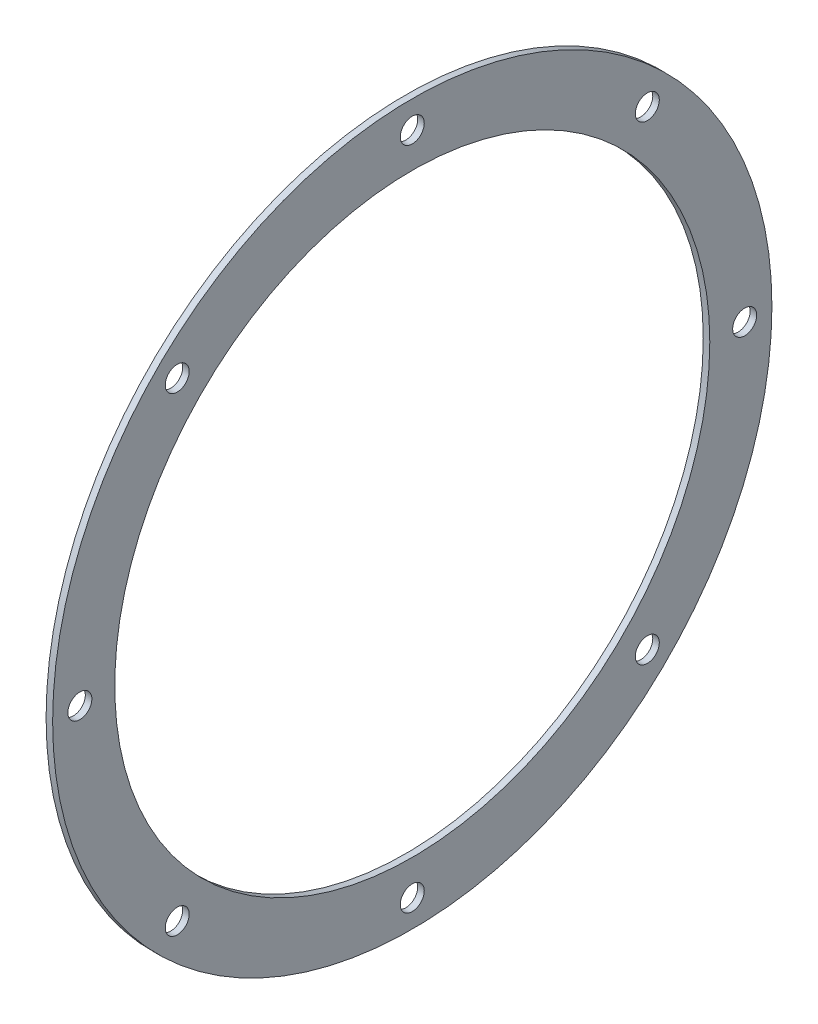
ISO-10303-21;
HEADER;
FILE_DESCRIPTION(('STEP AP214'),'2;1');
FILE_NAME('part.step','',(''),(''),'','','');
FILE_SCHEMA(('AUTOMOTIVE_DESIGN { 1 0 10303 214 1 1 1 1 }'));
ENDSEC;
DATA;
#1=APPLICATION_CONTEXT('core data for automotive mechanical design processes');
#2=APPLICATION_PROTOCOL_DEFINITION('international standard','automotive_design',2000,#1);
#3=PRODUCT_CONTEXT('',#1,'mechanical');
#4=PRODUCT('Part','Part','',(#3));
#5=PRODUCT_RELATED_PRODUCT_CATEGORY('part','',(#4));
#6=PRODUCT_DEFINITION_FORMATION('','',#4);
#7=PRODUCT_DEFINITION_CONTEXT('part definition',#1,'design');
#8=PRODUCT_DEFINITION('design','',#6,#7);
#9=PRODUCT_DEFINITION_SHAPE('','',#8);
#10=(LENGTH_UNIT() NAMED_UNIT(*) SI_UNIT(.MILLI.,.METRE.));
#11=(NAMED_UNIT(*) PLANE_ANGLE_UNIT() SI_UNIT($,.RADIAN.));
#12=(NAMED_UNIT(*) SI_UNIT($,.STERADIAN.) SOLID_ANGLE_UNIT());
#13=UNCERTAINTY_MEASURE_WITH_UNIT(LENGTH_MEASURE(1.E-05),#10,'distance_accuracy_value','');
#14=(GEOMETRIC_REPRESENTATION_CONTEXT(3) GLOBAL_UNCERTAINTY_ASSIGNED_CONTEXT((#13)) GLOBAL_UNIT_ASSIGNED_CONTEXT((#10,
#11,#12)) REPRESENTATION_CONTEXT('',''));
#15=CARTESIAN_POINT('',(0.,0.,0.));
#16=DIRECTION('',(0.,0.,1.));
#17=DIRECTION('',(1.,0.,0.));
#18=AXIS2_PLACEMENT_3D('',#15,#16,#17);
#19=CARTESIAN_POINT('',(-3.,0.,0.));
#20=DIRECTION('',(1.,0.,0.));
#21=DIRECTION('',(0.,0.,-1.));
#22=AXIS2_PLACEMENT_3D('',#19,#20,#21);
#23=CYLINDRICAL_SURFACE('',#22,165.);
#24=CARTESIAN_POINT('',(-3.,0.,0.));
#25=DIRECTION('',(1.,0.,0.));
#26=DIRECTION('',(0.,0.,-1.));
#27=AXIS2_PLACEMENT_3D('',#24,#25,#26);
#28=CIRCLE('',#27,165.);
#29=CARTESIAN_POINT('',(-3.,0.,-165.));
#30=VERTEX_POINT('',#29);
#31=EDGE_CURVE('E10',#30,#30,#28,.T.);
#32=ORIENTED_EDGE('',*,*,#31,.T.);
#33=EDGE_LOOP('',(#32));
#34=FACE_BOUND('',#33,.T.);
#35=CARTESIAN_POINT('',(0.,0.,0.));
#36=DIRECTION('',(1.,0.,0.));
#37=DIRECTION('',(0.,0.,-1.));
#38=AXIS2_PLACEMENT_3D('',#35,#36,#37);
#39=CIRCLE('',#38,165.);
#40=CARTESIAN_POINT('',(0.,0.,-165.));
#41=VERTEX_POINT('',#40);
#42=EDGE_CURVE('E36',#41,#41,#39,.T.);
#43=ORIENTED_EDGE('',*,*,#42,.F.);
#44=EDGE_LOOP('',(#43));
#45=FACE_BOUND('',#44,.T.);
#46=ADVANCED_FACE('F33',(#34,#45),#23,.T.);
#47=CARTESIAN_POINT('',(-3.,0.,0.));
#48=DIRECTION('',(1.,0.,0.));
#49=DIRECTION('',(0.,0.,-1.));
#50=AXIS2_PLACEMENT_3D('',#47,#48,#49);
#51=PLANE('',#50);
#52=CARTESIAN_POINT('',(-3.,107.83378413095,-107.833784130947));
#53=DIRECTION('',(1.,0.,0.));
#54=DIRECTION('',(0.,0.,-1.));
#55=AXIS2_PLACEMENT_3D('',#52,#53,#54);
#56=CIRCLE('',#55,5.5);
#57=CARTESIAN_POINT('',(-3.,107.83378413095,-113.333784130947));
#58=VERTEX_POINT('',#57);
#59=EDGE_CURVE('E92',#58,#58,#56,.T.);
#60=ORIENTED_EDGE('',*,*,#59,.T.);
#61=EDGE_LOOP('',(#60));
#62=FACE_BOUND('',#61,.T.);
#63=CARTESIAN_POINT('',(-3.,1.59735271252073E-12,-152.5));
#64=DIRECTION('',(1.,0.,0.));
#65=DIRECTION('',(0.,0.,-1.));
#66=AXIS2_PLACEMENT_3D('',#63,#64,#65);
#67=CIRCLE('',#66,5.49999999999999);
#68=CARTESIAN_POINT('',(-3.,1.59735271252073E-12,-158.));
#69=VERTEX_POINT('',#68);
#70=EDGE_CURVE('E86',#69,#69,#67,.T.);
#71=ORIENTED_EDGE('',*,*,#70,.T.);
#72=EDGE_LOOP('',(#71));
#73=FACE_BOUND('',#72,.T.);
#74=CARTESIAN_POINT('',(-3.,-107.833784130948,-107.833784130949));
#75=DIRECTION('',(1.,0.,0.));
#76=DIRECTION('',(0.,0.,-1.));
#77=AXIS2_PLACEMENT_3D('',#74,#75,#76);
#78=CIRCLE('',#77,5.5);
#79=CARTESIAN_POINT('',(-3.,-107.833784130948,-113.333784130949));
#80=VERTEX_POINT('',#79);
#81=EDGE_CURVE('E80',#80,#80,#78,.T.);
#82=ORIENTED_EDGE('',*,*,#81,.T.);
#83=EDGE_LOOP('',(#82));
#84=FACE_BOUND('',#83,.T.);
#85=CARTESIAN_POINT('',(-3.,-152.5,0.));
#86=DIRECTION('',(1.,0.,0.));
#87=DIRECTION('',(0.,0.,-1.));
#88=AXIS2_PLACEMENT_3D('',#85,#86,#87);
#89=CIRCLE('',#88,5.49999999999999);
#90=CARTESIAN_POINT('',(-3.,-152.5,-5.49999999999999));
#91=VERTEX_POINT('',#90);
#92=EDGE_CURVE('E74',#91,#91,#89,.T.);
#93=ORIENTED_EDGE('',*,*,#92,.T.);
#94=EDGE_LOOP('',(#93));
#95=FACE_BOUND('',#94,.T.);
#96=CARTESIAN_POINT('',(-3.,-107.833784130949,107.833784130948));
#97=DIRECTION('',(1.,0.,0.));
#98=DIRECTION('',(0.,0.,-1.));
#99=AXIS2_PLACEMENT_3D('',#96,#97,#98);
#100=CIRCLE('',#99,5.5);
#101=CARTESIAN_POINT('',(-3.,-107.833784130949,102.333784130948));
#102=VERTEX_POINT('',#101);
#103=EDGE_CURVE('E68',#102,#102,#100,.T.);
#104=ORIENTED_EDGE('',*,*,#103,.T.);
#105=EDGE_LOOP('',(#104));
#106=FACE_BOUND('',#105,.T.);
#107=CARTESIAN_POINT('',(-3.,-5.32450904173578E-13,152.5));
#108=DIRECTION('',(1.,0.,0.));
#109=DIRECTION('',(0.,0.,-1.));
#110=AXIS2_PLACEMENT_3D('',#107,#108,#109);
#111=CIRCLE('',#110,5.49999999999999);
#112=CARTESIAN_POINT('',(-3.,-5.32450904173578E-13,147.));
#113=VERTEX_POINT('',#112);
#114=EDGE_CURVE('E62',#113,#113,#111,.T.);
#115=ORIENTED_EDGE('',*,*,#114,.T.);
#116=EDGE_LOOP('',(#115));
#117=FACE_BOUND('',#116,.T.);
#118=CARTESIAN_POINT('',(-3.,107.833784130948,107.833784130949));
#119=DIRECTION('',(1.,0.,0.));
#120=DIRECTION('',(0.,0.,-1.));
#121=AXIS2_PLACEMENT_3D('',#118,#119,#120);
#122=CIRCLE('',#121,5.5);
#123=CARTESIAN_POINT('',(-3.,107.833784130948,102.333784130949));
#124=VERTEX_POINT('',#123);
#125=EDGE_CURVE('E56',#124,#124,#122,.T.);
#126=ORIENTED_EDGE('',*,*,#125,.T.);
#127=EDGE_LOOP('',(#126));
#128=FACE_BOUND('',#127,.T.);
#129=CARTESIAN_POINT('',(-3.,152.5,0.));
#130=DIRECTION('',(1.,0.,0.));
#131=DIRECTION('',(0.,0.,-1.));
#132=AXIS2_PLACEMENT_3D('',#129,#130,#131);
#133=CIRCLE('',#132,5.49999999999999);
#134=CARTESIAN_POINT('',(-3.,152.5,-5.49999999999999));
#135=VERTEX_POINT('',#134);
#136=EDGE_CURVE('E48',#135,#135,#133,.T.);
#137=ORIENTED_EDGE('',*,*,#136,.T.);
#138=EDGE_LOOP('',(#137));
#139=FACE_BOUND('',#138,.T.);
#140=CARTESIAN_POINT('',(-3.,0.,0.));
#141=DIRECTION('',(1.,0.,0.));
#142=DIRECTION('',(0.,0.,-1.));
#143=AXIS2_PLACEMENT_3D('',#140,#141,#142);
#144=CIRCLE('',#143,136.5);
#145=CARTESIAN_POINT('',(-3.,0.,-136.5));
#146=VERTEX_POINT('',#145);
#147=EDGE_CURVE('E43',#146,#146,#144,.T.);
#148=ORIENTED_EDGE('',*,*,#147,.T.);
#149=EDGE_LOOP('',(#148));
#150=FACE_BOUND('',#149,.T.);
#151=ORIENTED_EDGE('',*,*,#31,.F.);
#152=EDGE_LOOP('',(#151));
#153=FACE_BOUND('',#152,.T.);
#154=ADVANCED_FACE('F105',(#62,#73,#84,#95,#106,#117,#128,#139,#150,#153),#51,.F.);
#155=CARTESIAN_POINT('',(0.,0.,0.));
#156=DIRECTION('',(1.,0.,0.));
#157=DIRECTION('',(0.,0.,-1.));
#158=AXIS2_PLACEMENT_3D('',#155,#156,#157);
#159=PLANE('',#158);
#160=CARTESIAN_POINT('',(0.,107.83378413095,-107.833784130947));
#161=DIRECTION('',(1.,0.,0.));
#162=DIRECTION('',(0.,0.,-1.));
#163=AXIS2_PLACEMENT_3D('',#160,#161,#162);
#164=CIRCLE('',#163,5.49999999999999);
#165=CARTESIAN_POINT('',(0.,107.83378413095,-113.333784130947));
#166=VERTEX_POINT('',#165);
#167=EDGE_CURVE('E95',#166,#166,#164,.T.);
#168=ORIENTED_EDGE('',*,*,#167,.F.);
#169=EDGE_LOOP('',(#168));
#170=FACE_BOUND('',#169,.T.);
#171=CARTESIAN_POINT('',(0.,1.59735271252073E-12,-152.5));
#172=DIRECTION('',(1.,0.,0.));
#173=DIRECTION('',(0.,0.,-1.));
#174=AXIS2_PLACEMENT_3D('',#171,#172,#173);
#175=CIRCLE('',#174,5.49999999999999);
#176=CARTESIAN_POINT('',(0.,1.59735271252073E-12,-158.));
#177=VERTEX_POINT('',#176);
#178=EDGE_CURVE('E89',#177,#177,#175,.T.);
#179=ORIENTED_EDGE('',*,*,#178,.F.);
#180=EDGE_LOOP('',(#179));
#181=FACE_BOUND('',#180,.T.);
#182=CARTESIAN_POINT('',(0.,-107.833784130948,-107.833784130949));
#183=DIRECTION('',(1.,0.,0.));
#184=DIRECTION('',(0.,0.,-1.));
#185=AXIS2_PLACEMENT_3D('',#182,#183,#184);
#186=CIRCLE('',#185,5.49999999999999);
#187=CARTESIAN_POINT('',(0.,-107.833784130948,-113.333784130949));
#188=VERTEX_POINT('',#187);
#189=EDGE_CURVE('E83',#188,#188,#186,.T.);
#190=ORIENTED_EDGE('',*,*,#189,.F.);
#191=EDGE_LOOP('',(#190));
#192=FACE_BOUND('',#191,.T.);
#193=CARTESIAN_POINT('',(0.,-152.5,0.));
#194=DIRECTION('',(1.,0.,0.));
#195=DIRECTION('',(0.,0.,-1.));
#196=AXIS2_PLACEMENT_3D('',#193,#194,#195);
#197=CIRCLE('',#196,5.49999999999998);
#198=CARTESIAN_POINT('',(0.,-152.5,-5.49999999999998));
#199=VERTEX_POINT('',#198);
#200=EDGE_CURVE('E77',#199,#199,#197,.T.);
#201=ORIENTED_EDGE('',*,*,#200,.F.);
#202=EDGE_LOOP('',(#201));
#203=FACE_BOUND('',#202,.T.);
#204=CARTESIAN_POINT('',(0.,-107.833784130949,107.833784130948));
#205=DIRECTION('',(1.,0.,0.));
#206=DIRECTION('',(0.,0.,-1.));
#207=AXIS2_PLACEMENT_3D('',#204,#205,#206);
#208=CIRCLE('',#207,5.49999999999999);
#209=CARTESIAN_POINT('',(0.,-107.833784130949,102.333784130948));
#210=VERTEX_POINT('',#209);
#211=EDGE_CURVE('E71',#210,#210,#208,.T.);
#212=ORIENTED_EDGE('',*,*,#211,.F.);
#213=EDGE_LOOP('',(#212));
#214=FACE_BOUND('',#213,.T.);
#215=CARTESIAN_POINT('',(0.,-5.32450904173578E-13,152.5));
#216=DIRECTION('',(1.,0.,0.));
#217=DIRECTION('',(0.,0.,-1.));
#218=AXIS2_PLACEMENT_3D('',#215,#216,#217);
#219=CIRCLE('',#218,5.49999999999999);
#220=CARTESIAN_POINT('',(0.,-5.32450904173578E-13,147.));
#221=VERTEX_POINT('',#220);
#222=EDGE_CURVE('E65',#221,#221,#219,.T.);
#223=ORIENTED_EDGE('',*,*,#222,.F.);
#224=EDGE_LOOP('',(#223));
#225=FACE_BOUND('',#224,.T.);
#226=CARTESIAN_POINT('',(0.,107.833784130948,107.833784130949));
#227=DIRECTION('',(1.,0.,0.));
#228=DIRECTION('',(0.,0.,-1.));
#229=AXIS2_PLACEMENT_3D('',#226,#227,#228);
#230=CIRCLE('',#229,5.49999999999999);
#231=CARTESIAN_POINT('',(0.,107.833784130948,102.333784130949));
#232=VERTEX_POINT('',#231);
#233=EDGE_CURVE('E59',#232,#232,#230,.T.);
#234=ORIENTED_EDGE('',*,*,#233,.F.);
#235=EDGE_LOOP('',(#234));
#236=FACE_BOUND('',#235,.T.);
#237=CARTESIAN_POINT('',(0.,152.5,0.));
#238=DIRECTION('',(1.,0.,0.));
#239=DIRECTION('',(0.,0.,-1.));
#240=AXIS2_PLACEMENT_3D('',#237,#238,#239);
#241=CIRCLE('',#240,5.49999999999998);
#242=CARTESIAN_POINT('',(0.,152.5,-5.49999999999998));
#243=VERTEX_POINT('',#242);
#244=EDGE_CURVE('E53',#243,#243,#241,.T.);
#245=ORIENTED_EDGE('',*,*,#244,.F.);
#246=EDGE_LOOP('',(#245));
#247=FACE_BOUND('',#246,.T.);
#248=CARTESIAN_POINT('',(0.,0.,0.));
#249=DIRECTION('',(1.,0.,0.));
#250=DIRECTION('',(0.,0.,-1.));
#251=AXIS2_PLACEMENT_3D('',#248,#249,#250);
#252=CIRCLE('',#251,136.5);
#253=CARTESIAN_POINT('',(0.,0.,-136.5));
#254=VERTEX_POINT('',#253);
#255=EDGE_CURVE('E45',#254,#254,#252,.T.);
#256=ORIENTED_EDGE('',*,*,#255,.F.);
#257=EDGE_LOOP('',(#256));
#258=FACE_BOUND('',#257,.T.);
#259=ORIENTED_EDGE('',*,*,#42,.T.);
#260=EDGE_LOOP('',(#259));
#261=FACE_BOUND('',#260,.T.);
#262=ADVANCED_FACE('F101',(#170,#181,#192,#203,#214,#225,#236,#247,#258,#261),#159,.T.);
#263=CARTESIAN_POINT('',(-3.,0.,0.));
#264=DIRECTION('',(1.,0.,0.));
#265=DIRECTION('',(0.,0.,-1.));
#266=AXIS2_PLACEMENT_3D('',#263,#264,#265);
#267=CYLINDRICAL_SURFACE('',#266,136.5);
#268=ORIENTED_EDGE('',*,*,#147,.F.);
#269=EDGE_LOOP('',(#268));
#270=FACE_BOUND('',#269,.T.);
#271=ORIENTED_EDGE('',*,*,#255,.T.);
#272=EDGE_LOOP('',(#271));
#273=FACE_BOUND('',#272,.T.);
#274=ADVANCED_FACE('F104',(#270,#273),#267,.F.);
#275=CARTESIAN_POINT('',(0.,152.5,0.));
#276=DIRECTION('',(1.,0.,0.));
#277=DIRECTION('',(0.,0.,-1.));
#278=AXIS2_PLACEMENT_3D('',#275,#276,#277);
#279=CYLINDRICAL_SURFACE('',#278,5.49999999999999);
#280=ORIENTED_EDGE('',*,*,#136,.F.);
#281=EDGE_LOOP('',(#280));
#282=FACE_BOUND('',#281,.T.);
#283=ORIENTED_EDGE('',*,*,#244,.T.);
#284=EDGE_LOOP('',(#283));
#285=FACE_BOUND('',#284,.T.);
#286=ADVANCED_FACE('F136',(#282,#285),#279,.F.);
#287=CARTESIAN_POINT('',(0.,107.833784130948,107.833784130949));
#288=DIRECTION('',(1.,0.,0.));
#289=DIRECTION('',(0.,0.,-1.));
#290=AXIS2_PLACEMENT_3D('',#287,#288,#289);
#291=CYLINDRICAL_SURFACE('',#290,5.5);
#292=ORIENTED_EDGE('',*,*,#125,.F.);
#293=EDGE_LOOP('',(#292));
#294=FACE_BOUND('',#293,.T.);
#295=ORIENTED_EDGE('',*,*,#233,.T.);
#296=EDGE_LOOP('',(#295));
#297=FACE_BOUND('',#296,.T.);
#298=ADVANCED_FACE('F140',(#294,#297),#291,.F.);
#299=CARTESIAN_POINT('',(0.,-5.32450904173578E-13,152.5));
#300=DIRECTION('',(1.,0.,0.));
#301=DIRECTION('',(0.,0.,-1.));
#302=AXIS2_PLACEMENT_3D('',#299,#300,#301);
#303=CYLINDRICAL_SURFACE('',#302,5.49999999999999);
#304=ORIENTED_EDGE('',*,*,#114,.F.);
#305=EDGE_LOOP('',(#304));
#306=FACE_BOUND('',#305,.T.);
#307=ORIENTED_EDGE('',*,*,#222,.T.);
#308=EDGE_LOOP('',(#307));
#309=FACE_BOUND('',#308,.T.);
#310=ADVANCED_FACE('F144',(#306,#309),#303,.F.);
#311=CARTESIAN_POINT('',(0.,-107.833784130949,107.833784130948));
#312=DIRECTION('',(1.,0.,0.));
#313=DIRECTION('',(0.,0.,-1.));
#314=AXIS2_PLACEMENT_3D('',#311,#312,#313);
#315=CYLINDRICAL_SURFACE('',#314,5.5);
#316=ORIENTED_EDGE('',*,*,#103,.F.);
#317=EDGE_LOOP('',(#316));
#318=FACE_BOUND('',#317,.T.);
#319=ORIENTED_EDGE('',*,*,#211,.T.);
#320=EDGE_LOOP('',(#319));
#321=FACE_BOUND('',#320,.T.);
#322=ADVANCED_FACE('F148',(#318,#321),#315,.F.);
#323=CARTESIAN_POINT('',(0.,-152.5,0.));
#324=DIRECTION('',(1.,0.,0.));
#325=DIRECTION('',(0.,0.,-1.));
#326=AXIS2_PLACEMENT_3D('',#323,#324,#325);
#327=CYLINDRICAL_SURFACE('',#326,5.49999999999999);
#328=ORIENTED_EDGE('',*,*,#92,.F.);
#329=EDGE_LOOP('',(#328));
#330=FACE_BOUND('',#329,.T.);
#331=ORIENTED_EDGE('',*,*,#200,.T.);
#332=EDGE_LOOP('',(#331));
#333=FACE_BOUND('',#332,.T.);
#334=ADVANCED_FACE('F152',(#330,#333),#327,.F.);
#335=CARTESIAN_POINT('',(0.,-107.833784130948,-107.833784130949));
#336=DIRECTION('',(1.,0.,0.));
#337=DIRECTION('',(0.,0.,-1.));
#338=AXIS2_PLACEMENT_3D('',#335,#336,#337);
#339=CYLINDRICAL_SURFACE('',#338,5.5);
#340=ORIENTED_EDGE('',*,*,#81,.F.);
#341=EDGE_LOOP('',(#340));
#342=FACE_BOUND('',#341,.T.);
#343=ORIENTED_EDGE('',*,*,#189,.T.);
#344=EDGE_LOOP('',(#343));
#345=FACE_BOUND('',#344,.T.);
#346=ADVANCED_FACE('F156',(#342,#345),#339,.F.);
#347=CARTESIAN_POINT('',(0.,1.59735271252073E-12,-152.5));
#348=DIRECTION('',(1.,0.,0.));
#349=DIRECTION('',(0.,0.,-1.));
#350=AXIS2_PLACEMENT_3D('',#347,#348,#349);
#351=CYLINDRICAL_SURFACE('',#350,5.49999999999999);
#352=ORIENTED_EDGE('',*,*,#70,.F.);
#353=EDGE_LOOP('',(#352));
#354=FACE_BOUND('',#353,.T.);
#355=ORIENTED_EDGE('',*,*,#178,.T.);
#356=EDGE_LOOP('',(#355));
#357=FACE_BOUND('',#356,.T.);
#358=ADVANCED_FACE('F160',(#354,#357),#351,.F.);
#359=CARTESIAN_POINT('',(0.,107.83378413095,-107.833784130947));
#360=DIRECTION('',(1.,0.,0.));
#361=DIRECTION('',(0.,0.,-1.));
#362=AXIS2_PLACEMENT_3D('',#359,#360,#361);
#363=CYLINDRICAL_SURFACE('',#362,5.5);
#364=ORIENTED_EDGE('',*,*,#59,.F.);
#365=EDGE_LOOP('',(#364));
#366=FACE_BOUND('',#365,.T.);
#367=ORIENTED_EDGE('',*,*,#167,.T.);
#368=EDGE_LOOP('',(#367));
#369=FACE_BOUND('',#368,.T.);
#370=ADVANCED_FACE('F99',(#366,#369),#363,.F.);
#371=CLOSED_SHELL('',(#46,#154,#262,#274,#286,#298,#310,#322,#334,#346,#358,#370));
#372=MANIFOLD_SOLID_BREP('B2',#371);
#373=ADVANCED_BREP_SHAPE_REPRESENTATION('',(#18,#372),#14);
#374=SHAPE_DEFINITION_REPRESENTATION(#9,#373);
ENDSEC;
END-ISO-10303-21;
